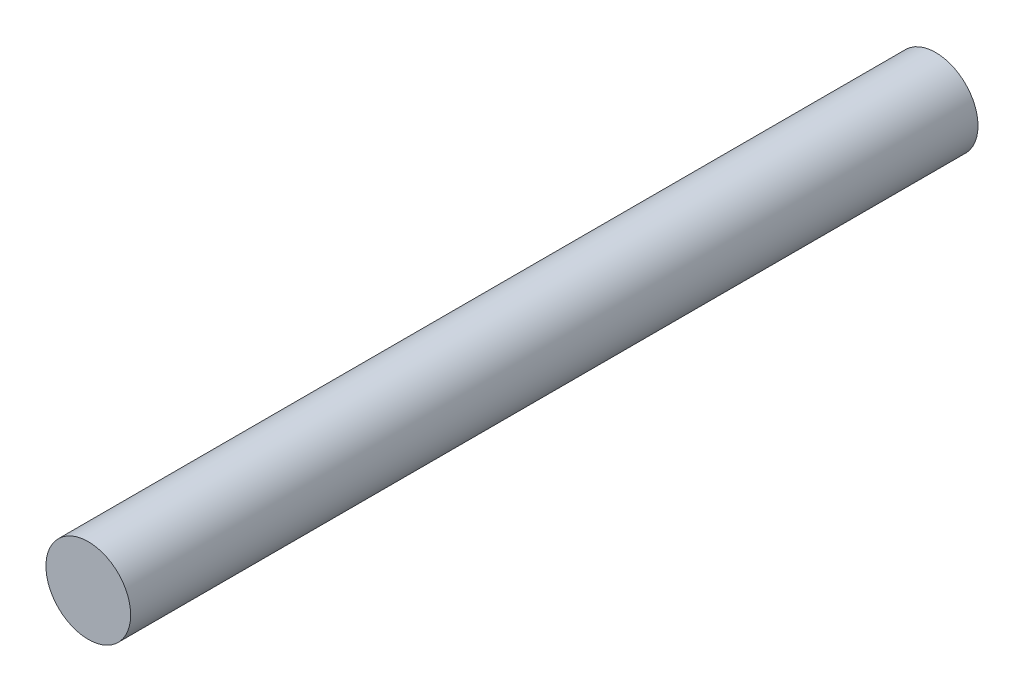
ISO-10303-21;
HEADER;
FILE_DESCRIPTION(('STEP AP214'),'2;1');
FILE_NAME('part.step','',(''),(''),'','','');
FILE_SCHEMA(('AUTOMOTIVE_DESIGN { 1 0 10303 214 1 1 1 1 }'));
ENDSEC;
DATA;
#1=APPLICATION_CONTEXT('core data for automotive mechanical design processes');
#2=APPLICATION_PROTOCOL_DEFINITION('international standard','automotive_design',2000,#1);
#3=PRODUCT_CONTEXT('',#1,'mechanical');
#4=PRODUCT('Part','Part','',(#3));
#5=PRODUCT_RELATED_PRODUCT_CATEGORY('part','',(#4));
#6=PRODUCT_DEFINITION_FORMATION('','',#4);
#7=PRODUCT_DEFINITION_CONTEXT('part definition',#1,'design');
#8=PRODUCT_DEFINITION('design','',#6,#7);
#9=PRODUCT_DEFINITION_SHAPE('','',#8);
#10=(LENGTH_UNIT() NAMED_UNIT(*) SI_UNIT(.MILLI.,.METRE.));
#11=(NAMED_UNIT(*) PLANE_ANGLE_UNIT() SI_UNIT($,.RADIAN.));
#12=(NAMED_UNIT(*) SI_UNIT($,.STERADIAN.) SOLID_ANGLE_UNIT());
#13=UNCERTAINTY_MEASURE_WITH_UNIT(LENGTH_MEASURE(1.E-05),#10,'distance_accuracy_value','');
#14=(GEOMETRIC_REPRESENTATION_CONTEXT(3) GLOBAL_UNCERTAINTY_ASSIGNED_CONTEXT((#13)) GLOBAL_UNIT_ASSIGNED_CONTEXT((#10,
#11,#12)) REPRESENTATION_CONTEXT('',''));
#15=CARTESIAN_POINT('',(0.,0.,0.));
#16=DIRECTION('',(0.,0.,1.));
#17=DIRECTION('',(1.,0.,0.));
#18=AXIS2_PLACEMENT_3D('',#15,#16,#17);
#19=CARTESIAN_POINT('',(0.,0.,100.));
#20=DIRECTION('',(0.,0.,-1.));
#21=DIRECTION('',(-1.,0.,0.));
#22=AXIS2_PLACEMENT_3D('',#19,#20,#21);
#23=CYLINDRICAL_SURFACE('',#22,10.);
#24=CARTESIAN_POINT('',(0.,0.,100.));
#25=DIRECTION('',(0.,0.,1.));
#26=DIRECTION('',(1.,0.,0.));
#27=AXIS2_PLACEMENT_3D('',#24,#25,#26);
#28=CIRCLE('',#27,10.);
#29=CARTESIAN_POINT('',(10.,0.,100.));
#30=VERTEX_POINT('',#29);
#31=EDGE_CURVE('E10',#30,#30,#28,.T.);
#32=ORIENTED_EDGE('',*,*,#31,.F.);
#33=EDGE_LOOP('',(#32));
#34=FACE_BOUND('',#33,.T.);
#35=CARTESIAN_POINT('',(0.,0.,-100.));
#36=DIRECTION('',(0.,0.,1.));
#37=DIRECTION('',(1.,0.,0.));
#38=AXIS2_PLACEMENT_3D('',#35,#36,#37);
#39=CIRCLE('',#38,10.);
#40=CARTESIAN_POINT('',(10.,0.,-100.));
#41=VERTEX_POINT('',#40);
#42=EDGE_CURVE('E37',#41,#41,#39,.T.);
#43=ORIENTED_EDGE('',*,*,#42,.T.);
#44=EDGE_LOOP('',(#43));
#45=FACE_BOUND('',#44,.T.);
#46=ADVANCED_FACE('F40',(#34,#45),#23,.T.);
#47=CARTESIAN_POINT('',(0.,0.,100.));
#48=DIRECTION('',(0.,0.,1.));
#49=DIRECTION('',(1.,0.,0.));
#50=AXIS2_PLACEMENT_3D('',#47,#48,#49);
#51=PLANE('',#50);
#52=ORIENTED_EDGE('',*,*,#31,.T.);
#53=EDGE_LOOP('',(#52));
#54=FACE_BOUND('',#53,.T.);
#55=ADVANCED_FACE('F55',(#54),#51,.T.);
#56=CARTESIAN_POINT('',(0.,0.,-100.));
#57=DIRECTION('',(0.,0.,1.));
#58=DIRECTION('',(1.,0.,0.));
#59=AXIS2_PLACEMENT_3D('',#56,#57,#58);
#60=PLANE('',#59);
#61=ORIENTED_EDGE('',*,*,#42,.F.);
#62=EDGE_LOOP('',(#61));
#63=FACE_BOUND('',#62,.T.);
#64=ADVANCED_FACE('F49',(#63),#60,.F.);
#65=CLOSED_SHELL('',(#46,#55,#64));
#66=MANIFOLD_SOLID_BREP('B2',#65);
#67=ADVANCED_BREP_SHAPE_REPRESENTATION('',(#18,#66),#14);
#68=SHAPE_DEFINITION_REPRESENTATION(#9,#67);
ENDSEC;
END-ISO-10303-21;
